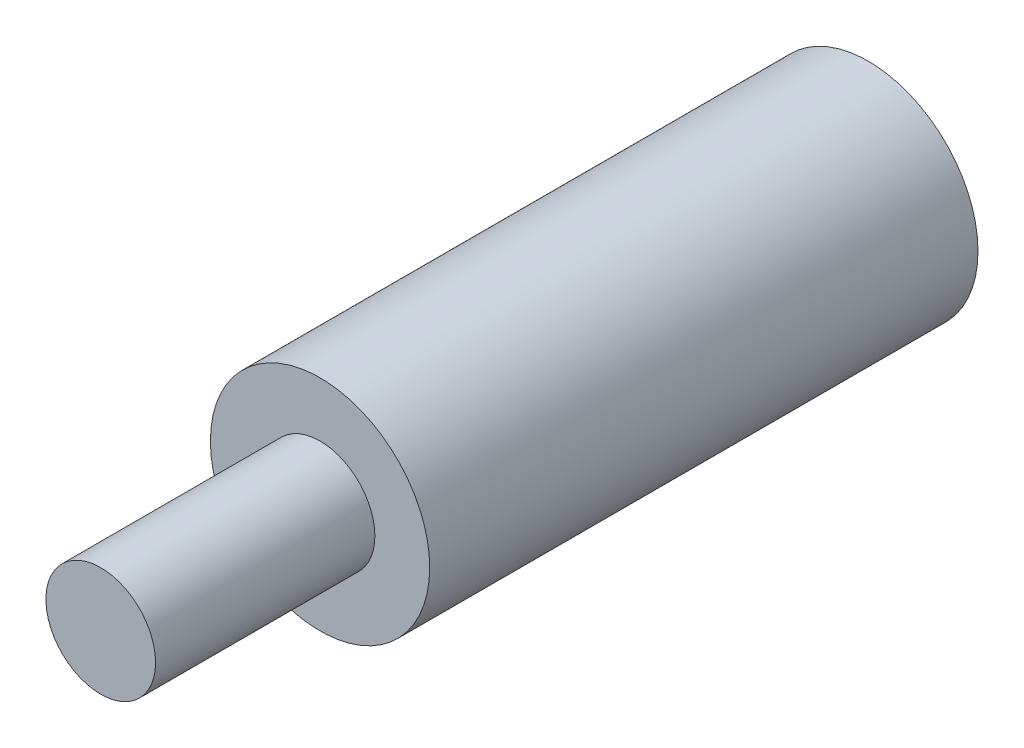
ISO-10303-21;
HEADER;
FILE_DESCRIPTION(('STEP AP214'),'2;1');
FILE_NAME('part.step','',(''),(''),'','','');
FILE_SCHEMA(('AUTOMOTIVE_DESIGN { 1 0 10303 214 1 1 1 1 }'));
ENDSEC;
DATA;
#1=APPLICATION_CONTEXT('core data for automotive mechanical design processes');
#2=APPLICATION_PROTOCOL_DEFINITION('international standard','automotive_design',2000,#1);
#3=PRODUCT_CONTEXT('',#1,'mechanical');
#4=PRODUCT('Part','Part','',(#3));
#5=PRODUCT_RELATED_PRODUCT_CATEGORY('part','',(#4));
#6=PRODUCT_DEFINITION_FORMATION('','',#4);
#7=PRODUCT_DEFINITION_CONTEXT('part definition',#1,'design');
#8=PRODUCT_DEFINITION('design','',#6,#7);
#9=PRODUCT_DEFINITION_SHAPE('','',#8);
#10=(LENGTH_UNIT() NAMED_UNIT(*) SI_UNIT(.MILLI.,.METRE.));
#11=(NAMED_UNIT(*) PLANE_ANGLE_UNIT() SI_UNIT($,.RADIAN.));
#12=(NAMED_UNIT(*) SI_UNIT($,.STERADIAN.) SOLID_ANGLE_UNIT());
#13=UNCERTAINTY_MEASURE_WITH_UNIT(LENGTH_MEASURE(1.E-05),#10,'distance_accuracy_value','');
#14=(GEOMETRIC_REPRESENTATION_CONTEXT(3) GLOBAL_UNCERTAINTY_ASSIGNED_CONTEXT((#13)) GLOBAL_UNIT_ASSIGNED_CONTEXT((#10,
#11,#12)) REPRESENTATION_CONTEXT('',''));
#15=CARTESIAN_POINT('',(0.,0.,0.));
#16=DIRECTION('',(0.,0.,1.));
#17=DIRECTION('',(1.,0.,0.));
#18=AXIS2_PLACEMENT_3D('',#15,#16,#17);
#19=CARTESIAN_POINT('',(0.,0.,21.));
#20=DIRECTION('',(0.,0.,-1.));
#21=DIRECTION('',(-1.,0.,0.));
#22=AXIS2_PLACEMENT_3D('',#19,#20,#21);
#23=CYLINDRICAL_SURFACE('',#22,1.5);
#24=CARTESIAN_POINT('',(0.,0.,21.));
#25=DIRECTION('',(0.,0.,1.));
#26=DIRECTION('',(1.,0.,0.));
#27=AXIS2_PLACEMENT_3D('',#24,#25,#26);
#28=CIRCLE('',#27,1.5);
#29=CARTESIAN_POINT('',(1.5,0.,21.));
#30=VERTEX_POINT('',#29);
#31=EDGE_CURVE('E11',#30,#30,#28,.T.);
#32=ORIENTED_EDGE('',*,*,#31,.F.);
#33=EDGE_LOOP('',(#32));
#34=FACE_BOUND('',#33,.T.);
#35=CARTESIAN_POINT('',(0.,0.,15.));
#36=DIRECTION('',(0.,0.,1.));
#37=DIRECTION('',(1.,0.,0.));
#38=AXIS2_PLACEMENT_3D('',#35,#36,#37);
#39=CIRCLE('',#38,1.5);
#40=CARTESIAN_POINT('',(1.5,0.,15.));
#41=VERTEX_POINT('',#40);
#42=EDGE_CURVE('E44',#41,#41,#39,.T.);
#43=ORIENTED_EDGE('',*,*,#42,.T.);
#44=EDGE_LOOP('',(#43));
#45=FACE_BOUND('',#44,.T.);
#46=ADVANCED_FACE('F41',(#34,#45),#23,.T.);
#47=CARTESIAN_POINT('',(0.,0.,21.));
#48=DIRECTION('',(0.,0.,1.));
#49=DIRECTION('',(1.,0.,0.));
#50=AXIS2_PLACEMENT_3D('',#47,#48,#49);
#51=PLANE('',#50);
#52=ORIENTED_EDGE('',*,*,#31,.T.);
#53=EDGE_LOOP('',(#52));
#54=FACE_BOUND('',#53,.T.);
#55=ADVANCED_FACE('F56',(#54),#51,.T.);
#56=CARTESIAN_POINT('',(0.,0.,15.));
#57=DIRECTION('',(0.,0.,1.));
#58=DIRECTION('',(1.,0.,0.));
#59=AXIS2_PLACEMENT_3D('',#56,#57,#58);
#60=PLANE('',#59);
#61=ORIENTED_EDGE('',*,*,#42,.F.);
#62=EDGE_LOOP('',(#61));
#63=FACE_BOUND('',#62,.T.);
#64=ADVANCED_FACE('F54',(#63),#60,.F.);
#65=CLOSED_SHELL('',(#46,#55,#64));
#66=MANIFOLD_SOLID_BREP('B2',#65);
#67=CARTESIAN_POINT('',(0.,0.,15.));
#68=DIRECTION('',(0.,0.,1.));
#69=DIRECTION('',(1.,0.,0.));
#70=AXIS2_PLACEMENT_3D('',#67,#68,#69);
#71=PLANE('',#70);
#72=CARTESIAN_POINT('',(0.,0.,15.));
#73=DIRECTION('',(0.,0.,1.));
#74=DIRECTION('',(1.,0.,0.));
#75=AXIS2_PLACEMENT_3D('',#72,#73,#74);
#76=CIRCLE('',#75,3.);
#77=CARTESIAN_POINT('',(3.,0.,15.));
#78=VERTEX_POINT('',#77);
#79=EDGE_CURVE('E40',#78,#78,#76,.T.);
#80=ORIENTED_EDGE('',*,*,#79,.T.);
#81=EDGE_LOOP('',(#80));
#82=FACE_BOUND('',#81,.T.);
#83=CARTESIAN_POINT('',(0.,0.,15.));
#84=DIRECTION('',(0.,0.,1.));
#85=DIRECTION('',(1.,0.,0.));
#86=AXIS2_PLACEMENT_3D('',#83,#84,#85);
#87=CIRCLE('',#86,1.5);
#88=CARTESIAN_POINT('',(1.5,0.,15.));
#89=VERTEX_POINT('',#88);
#90=EDGE_CURVE('E93',#89,#89,#87,.T.);
#91=ORIENTED_EDGE('',*,*,#90,.F.);
#92=EDGE_LOOP('',(#91));
#93=FACE_BOUND('',#92,.T.);
#94=ADVANCED_FACE('F82',(#82,#93),#71,.T.);
#95=CARTESIAN_POINT('',(0.,0.,0.));
#96=DIRECTION('',(0.,0.,1.));
#97=DIRECTION('',(1.,0.,0.));
#98=AXIS2_PLACEMENT_3D('',#95,#96,#97);
#99=PLANE('',#98);
#100=CARTESIAN_POINT('',(0.,0.,0.));
#101=DIRECTION('',(0.,0.,1.));
#102=DIRECTION('',(1.,0.,0.));
#103=AXIS2_PLACEMENT_3D('',#100,#101,#102);
#104=CIRCLE('',#103,3.);
#105=CARTESIAN_POINT('',(3.,0.,0.));
#106=VERTEX_POINT('',#105);
#107=EDGE_CURVE('E86',#106,#106,#104,.T.);
#108=ORIENTED_EDGE('',*,*,#107,.F.);
#109=EDGE_LOOP('',(#108));
#110=FACE_BOUND('',#109,.T.);
#111=CARTESIAN_POINT('',(0.,0.,0.));
#112=DIRECTION('',(0.,0.,1.));
#113=DIRECTION('',(1.,0.,0.));
#114=AXIS2_PLACEMENT_3D('',#111,#112,#113);
#115=CIRCLE('',#114,1.5);
#116=CARTESIAN_POINT('',(1.5,0.,0.));
#117=VERTEX_POINT('',#116);
#118=EDGE_CURVE('E95',#117,#117,#115,.T.);
#119=ORIENTED_EDGE('',*,*,#118,.T.);
#120=EDGE_LOOP('',(#119));
#121=FACE_BOUND('',#120,.T.);
#122=ADVANCED_FACE('F105',(#110,#121),#99,.F.);
#123=CARTESIAN_POINT('',(0.,0.,15.));
#124=DIRECTION('',(0.,0.,-1.));
#125=DIRECTION('',(-1.,0.,0.));
#126=AXIS2_PLACEMENT_3D('',#123,#124,#125);
#127=CYLINDRICAL_SURFACE('',#126,3.);
#128=ORIENTED_EDGE('',*,*,#79,.F.);
#129=EDGE_LOOP('',(#128));
#130=FACE_BOUND('',#129,.T.);
#131=ORIENTED_EDGE('',*,*,#107,.T.);
#132=EDGE_LOOP('',(#131));
#133=FACE_BOUND('',#132,.T.);
#134=ADVANCED_FACE('F84',(#130,#133),#127,.T.);
#135=CARTESIAN_POINT('',(0.,0.,15.));
#136=DIRECTION('',(0.,0.,-1.));
#137=DIRECTION('',(-1.,0.,0.));
#138=AXIS2_PLACEMENT_3D('',#135,#136,#137);
#139=CYLINDRICAL_SURFACE('',#138,1.5);
#140=ORIENTED_EDGE('',*,*,#90,.T.);
#141=EDGE_LOOP('',(#140));
#142=FACE_BOUND('',#141,.T.);
#143=ORIENTED_EDGE('',*,*,#118,.F.);
#144=EDGE_LOOP('',(#143));
#145=FACE_BOUND('',#144,.T.);
#146=ADVANCED_FACE('F101',(#142,#145),#139,.F.);
#147=CLOSED_SHELL('',(#94,#122,#134,#146));
#148=MANIFOLD_SOLID_BREP('B6',#147);
#149=ADVANCED_BREP_SHAPE_REPRESENTATION('',(#18,#66,#148),#14);
#150=SHAPE_DEFINITION_REPRESENTATION(#9,#149);
ENDSEC;
END-ISO-10303-21;
